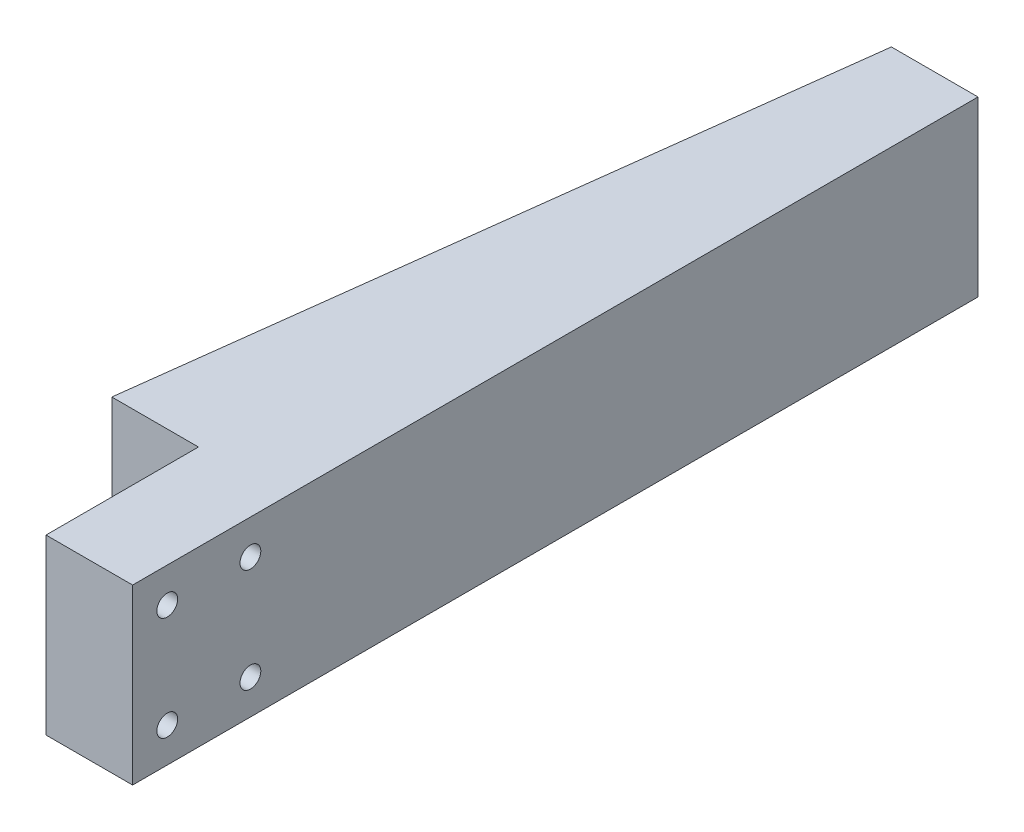
ISO-10303-21;
HEADER;
FILE_DESCRIPTION(('STEP AP214'),'2;1');
FILE_NAME('part.step','',(''),(''),'','','');
FILE_SCHEMA(('AUTOMOTIVE_DESIGN { 1 0 10303 214 1 1 1 1 }'));
ENDSEC;
DATA;
#1=APPLICATION_CONTEXT('core data for automotive mechanical design processes');
#2=APPLICATION_PROTOCOL_DEFINITION('international standard','automotive_design',2000,#1);
#3=PRODUCT_CONTEXT('',#1,'mechanical');
#4=PRODUCT('Part','Part','',(#3));
#5=PRODUCT_RELATED_PRODUCT_CATEGORY('part','',(#4));
#6=PRODUCT_DEFINITION_FORMATION('','',#4);
#7=PRODUCT_DEFINITION_CONTEXT('part definition',#1,'design');
#8=PRODUCT_DEFINITION('design','',#6,#7);
#9=PRODUCT_DEFINITION_SHAPE('','',#8);
#10=(LENGTH_UNIT() NAMED_UNIT(*) SI_UNIT(.MILLI.,.METRE.));
#11=(NAMED_UNIT(*) PLANE_ANGLE_UNIT() SI_UNIT($,.RADIAN.));
#12=(NAMED_UNIT(*) SI_UNIT($,.STERADIAN.) SOLID_ANGLE_UNIT());
#13=UNCERTAINTY_MEASURE_WITH_UNIT(LENGTH_MEASURE(1.E-05),#10,'distance_accuracy_value','');
#14=(GEOMETRIC_REPRESENTATION_CONTEXT(3) GLOBAL_UNCERTAINTY_ASSIGNED_CONTEXT((#13)) GLOBAL_UNIT_ASSIGNED_CONTEXT((#10,
#11,#12)) REPRESENTATION_CONTEXT('',''));
#15=CARTESIAN_POINT('',(0.,0.,0.));
#16=DIRECTION('',(0.,0.,1.));
#17=DIRECTION('',(1.,0.,0.));
#18=AXIS2_PLACEMENT_3D('',#15,#16,#17);
#19=CARTESIAN_POINT('',(-12.5,0.,0.));
#20=DIRECTION('',(0.,0.,1.));
#21=DIRECTION('',(1.,0.,0.));
#22=AXIS2_PLACEMENT_3D('',#19,#20,#21);
#23=PLANE('',#22);
#24=DIRECTION('',(0.,-1.,0.));
#25=VECTOR('',#24,1.);
#26=CARTESIAN_POINT('',(0.,0.,0.));
#27=LINE('',#26,#25);
#28=CARTESIAN_POINT('',(0.,25.,0.));
#29=VERTEX_POINT('',#28);
#30=CARTESIAN_POINT('',(0.,0.,0.));
#31=VERTEX_POINT('',#30);
#32=EDGE_CURVE('E164',#29,#31,#27,.T.);
#33=ORIENTED_EDGE('',*,*,#32,.F.);
#34=DIRECTION('',(1.,0.,0.));
#35=VECTOR('',#34,1.);
#36=CARTESIAN_POINT('',(-12.5,25.,0.));
#37=LINE('',#36,#35);
#38=CARTESIAN_POINT('',(-12.5,25.,0.));
#39=VERTEX_POINT('',#38);
#40=EDGE_CURVE('E11',#39,#29,#37,.T.);
#41=ORIENTED_EDGE('',*,*,#40,.F.);
#42=DIRECTION('',(0.,-1.,0.));
#43=VECTOR('',#42,1.);
#44=CARTESIAN_POINT('',(-12.5,0.,0.));
#45=LINE('',#44,#43);
#46=CARTESIAN_POINT('',(-12.5,0.,0.));
#47=VERTEX_POINT('',#46);
#48=EDGE_CURVE('E168',#39,#47,#45,.T.);
#49=ORIENTED_EDGE('',*,*,#48,.T.);
#50=DIRECTION('',(1.,0.,0.));
#51=VECTOR('',#50,1.);
#52=CARTESIAN_POINT('',(-12.5,0.,0.));
#53=LINE('',#52,#51);
#54=EDGE_CURVE('E48',#47,#31,#53,.T.);
#55=ORIENTED_EDGE('',*,*,#54,.T.);
#56=EDGE_LOOP('',(#33,#41,#49,#55));
#57=FACE_BOUND('',#56,.T.);
#58=ADVANCED_FACE('F45',(#57),#23,.T.);
#59=CARTESIAN_POINT('',(-12.5,25.,0.));
#60=DIRECTION('',(0.,1.,0.));
#61=DIRECTION('',(0.,0.,1.));
#62=AXIS2_PLACEMENT_3D('',#59,#60,#61);
#63=PLANE('',#62);
#64=DIRECTION('',(0.,0.,1.));
#65=VECTOR('',#64,1.);
#66=CARTESIAN_POINT('',(0.,25.,0.));
#67=LINE('',#66,#65);
#68=CARTESIAN_POINT('',(0.,25.,-122.));
#69=VERTEX_POINT('',#68);
#70=EDGE_CURVE('E172',#69,#29,#67,.T.);
#71=ORIENTED_EDGE('',*,*,#70,.F.);
#72=DIRECTION('',(1.,0.,0.));
#73=VECTOR('',#72,1.);
#74=CARTESIAN_POINT('',(-12.5,25.,-122.));
#75=LINE('',#74,#73);
#76=CARTESIAN_POINT('',(-12.5,25.,-122.));
#77=VERTEX_POINT('',#76);
#78=EDGE_CURVE('E54',#77,#69,#75,.T.);
#79=ORIENTED_EDGE('',*,*,#78,.F.);
#80=DIRECTION('',(-0.124034734589208,0.,0.992277876713668));
#81=VECTOR('',#80,1.);
#82=CARTESIAN_POINT('',(-12.5,25.,-122.));
#83=LINE('',#82,#81);
#84=CARTESIAN_POINT('',(-25.,25.,-22.));
#85=VERTEX_POINT('',#84);
#86=EDGE_CURVE('E128',#77,#85,#83,.T.);
#87=ORIENTED_EDGE('',*,*,#86,.T.);
#88=DIRECTION('',(1.,0.,0.));
#89=VECTOR('',#88,1.);
#90=CARTESIAN_POINT('',(-25.,25.,-22.));
#91=LINE('',#90,#89);
#92=CARTESIAN_POINT('',(-12.5,25.,-22.));
#93=VERTEX_POINT('',#92);
#94=EDGE_CURVE('E109',#85,#93,#91,.T.);
#95=ORIENTED_EDGE('',*,*,#94,.T.);
#96=DIRECTION('',(0.,0.,1.));
#97=VECTOR('',#96,1.);
#98=CARTESIAN_POINT('',(-12.5,25.,0.));
#99=LINE('',#98,#97);
#100=EDGE_CURVE('E69',#93,#39,#99,.T.);
#101=ORIENTED_EDGE('',*,*,#100,.T.);
#102=ORIENTED_EDGE('',*,*,#40,.T.);
#103=EDGE_LOOP('',(#71,#79,#87,#95,#101,#102));
#104=FACE_BOUND('',#103,.T.);
#105=ADVANCED_FACE('F202',(#104),#63,.T.);
#106=CARTESIAN_POINT('',(-12.5,0.,-122.));
#107=DIRECTION('',(0.,0.,-1.));
#108=DIRECTION('',(-1.,0.,0.));
#109=AXIS2_PLACEMENT_3D('',#106,#107,#108);
#110=PLANE('',#109);
#111=DIRECTION('',(0.,1.,0.));
#112=VECTOR('',#111,1.);
#113=CARTESIAN_POINT('',(0.,0.,-122.));
#114=LINE('',#113,#112);
#115=CARTESIAN_POINT('',(0.,0.,-122.));
#116=VERTEX_POINT('',#115);
#117=EDGE_CURVE('E186',#116,#69,#114,.T.);
#118=ORIENTED_EDGE('',*,*,#117,.F.);
#119=DIRECTION('',(1.,0.,0.));
#120=VECTOR('',#119,1.);
#121=CARTESIAN_POINT('',(-12.5,0.,-122.));
#122=LINE('',#121,#120);
#123=CARTESIAN_POINT('',(-12.5,0.,-122.));
#124=VERTEX_POINT('',#123);
#125=EDGE_CURVE('E194',#124,#116,#122,.T.);
#126=ORIENTED_EDGE('',*,*,#125,.F.);
#127=DIRECTION('',(0.,1.,0.));
#128=VECTOR('',#127,1.);
#129=CARTESIAN_POINT('',(-12.5,0.,-122.));
#130=LINE('',#129,#128);
#131=EDGE_CURVE('E120',#124,#77,#130,.T.);
#132=ORIENTED_EDGE('',*,*,#131,.T.);
#133=ORIENTED_EDGE('',*,*,#78,.T.);
#134=EDGE_LOOP('',(#118,#126,#132,#133));
#135=FACE_BOUND('',#134,.T.);
#136=ADVANCED_FACE('F204',(#135),#110,.T.);
#137=CARTESIAN_POINT('',(-12.5,0.,0.));
#138=DIRECTION('',(0.,-1.,0.));
#139=DIRECTION('',(0.,0.,-1.));
#140=AXIS2_PLACEMENT_3D('',#137,#138,#139);
#141=PLANE('',#140);
#142=DIRECTION('',(0.,0.,-1.));
#143=VECTOR('',#142,1.);
#144=CARTESIAN_POINT('',(0.,0.,0.));
#145=LINE('',#144,#143);
#146=EDGE_CURVE('E182',#31,#116,#145,.T.);
#147=ORIENTED_EDGE('',*,*,#146,.F.);
#148=ORIENTED_EDGE('',*,*,#54,.F.);
#149=DIRECTION('',(0.,0.,-1.));
#150=VECTOR('',#149,1.);
#151=CARTESIAN_POINT('',(-12.5,0.,0.));
#152=LINE('',#151,#150);
#153=CARTESIAN_POINT('',(-12.5,0.,-22.));
#154=VERTEX_POINT('',#153);
#155=EDGE_CURVE('E124',#47,#154,#152,.T.);
#156=ORIENTED_EDGE('',*,*,#155,.T.);
#157=DIRECTION('',(1.,0.,0.));
#158=VECTOR('',#157,1.);
#159=CARTESIAN_POINT('',(-25.,0.,-22.));
#160=LINE('',#159,#158);
#161=CARTESIAN_POINT('',(-25.,0.,-22.));
#162=VERTEX_POINT('',#161);
#163=EDGE_CURVE('E108',#162,#154,#160,.T.);
#164=ORIENTED_EDGE('',*,*,#163,.F.);
#165=DIRECTION('',(-0.124034734589208,0.,0.992277876713668));
#166=VECTOR('',#165,1.);
#167=CARTESIAN_POINT('',(-12.5,0.,-122.));
#168=LINE('',#167,#166);
#169=EDGE_CURVE('E117',#124,#162,#168,.T.);
#170=ORIENTED_EDGE('',*,*,#169,.F.);
#171=ORIENTED_EDGE('',*,*,#125,.T.);
#172=EDGE_LOOP('',(#147,#148,#156,#164,#170,#171));
#173=FACE_BOUND('',#172,.T.);
#174=ADVANCED_FACE('F123',(#173),#141,.T.);
#175=CARTESIAN_POINT('',(-12.5,0.,0.));
#176=DIRECTION('',(-1.,0.,0.));
#177=DIRECTION('',(0.,0.,1.));
#178=AXIS2_PLACEMENT_3D('',#175,#176,#177);
#179=PLANE('',#178);
#180=DIRECTION('',(0.,1.,0.));
#181=VECTOR('',#180,1.);
#182=CARTESIAN_POINT('',(-12.5,0.,-22.));
#183=LINE('',#182,#181);
#184=EDGE_CURVE('E62',#154,#93,#183,.T.);
#185=ORIENTED_EDGE('',*,*,#184,.F.);
#186=ORIENTED_EDGE('',*,*,#155,.F.);
#187=ORIENTED_EDGE('',*,*,#48,.F.);
#188=ORIENTED_EDGE('',*,*,#100,.F.);
#189=EDGE_LOOP('',(#185,#186,#187,#188));
#190=FACE_BOUND('',#189,.T.);
#191=CARTESIAN_POINT('',(-12.5,5.,-5.));
#192=DIRECTION('',(1.,0.,0.));
#193=DIRECTION('',(0.,0.,-1.));
#194=AXIS2_PLACEMENT_3D('',#191,#192,#193);
#195=CIRCLE('',#194,1.5);
#196=CARTESIAN_POINT('',(-12.5,5.,-6.5));
#197=VERTEX_POINT('',#196);
#198=EDGE_CURVE('E136',#197,#197,#195,.T.);
#199=ORIENTED_EDGE('',*,*,#198,.T.);
#200=EDGE_LOOP('',(#199));
#201=FACE_BOUND('',#200,.T.);
#202=CARTESIAN_POINT('',(-12.5,5.,-17.));
#203=DIRECTION('',(1.,0.,0.));
#204=DIRECTION('',(0.,0.,-1.));
#205=AXIS2_PLACEMENT_3D('',#202,#203,#204);
#206=CIRCLE('',#205,1.5);
#207=CARTESIAN_POINT('',(-12.5,5.,-18.5));
#208=VERTEX_POINT('',#207);
#209=EDGE_CURVE('E144',#208,#208,#206,.T.);
#210=ORIENTED_EDGE('',*,*,#209,.T.);
#211=EDGE_LOOP('',(#210));
#212=FACE_BOUND('',#211,.T.);
#213=CARTESIAN_POINT('',(-12.5,20.,-17.));
#214=DIRECTION('',(1.,0.,0.));
#215=DIRECTION('',(0.,0.,-1.));
#216=AXIS2_PLACEMENT_3D('',#213,#214,#215);
#217=CIRCLE('',#216,1.5);
#218=CARTESIAN_POINT('',(-12.5,20.,-18.5));
#219=VERTEX_POINT('',#218);
#220=EDGE_CURVE('E152',#219,#219,#217,.T.);
#221=ORIENTED_EDGE('',*,*,#220,.T.);
#222=EDGE_LOOP('',(#221));
#223=FACE_BOUND('',#222,.T.);
#224=CARTESIAN_POINT('',(-12.5,20.,-5.));
#225=DIRECTION('',(1.,0.,0.));
#226=DIRECTION('',(0.,0.,-1.));
#227=AXIS2_PLACEMENT_3D('',#224,#225,#226);
#228=CIRCLE('',#227,1.5);
#229=CARTESIAN_POINT('',(-12.5,20.,-6.5));
#230=VERTEX_POINT('',#229);
#231=EDGE_CURVE('E160',#230,#230,#228,.T.);
#232=ORIENTED_EDGE('',*,*,#231,.T.);
#233=EDGE_LOOP('',(#232));
#234=FACE_BOUND('',#233,.T.);
#235=ADVANCED_FACE('F211',(#190,#201,#212,#223,#234),#179,.T.);
#236=CARTESIAN_POINT('',(0.,0.,0.));
#237=DIRECTION('',(-1.,0.,0.));
#238=DIRECTION('',(0.,0.,1.));
#239=AXIS2_PLACEMENT_3D('',#236,#237,#238);
#240=PLANE('',#239);
#241=CARTESIAN_POINT('',(0.,5.,-5.));
#242=DIRECTION('',(1.,0.,0.));
#243=DIRECTION('',(0.,0.,-1.));
#244=AXIS2_PLACEMENT_3D('',#241,#242,#243);
#245=CIRCLE('',#244,1.5);
#246=CARTESIAN_POINT('',(0.,5.,-6.5));
#247=VERTEX_POINT('',#246);
#248=EDGE_CURVE('E134',#247,#247,#245,.T.);
#249=ORIENTED_EDGE('',*,*,#248,.F.);
#250=EDGE_LOOP('',(#249));
#251=FACE_BOUND('',#250,.T.);
#252=CARTESIAN_POINT('',(0.,5.,-17.));
#253=DIRECTION('',(1.,0.,0.));
#254=DIRECTION('',(0.,0.,-1.));
#255=AXIS2_PLACEMENT_3D('',#252,#253,#254);
#256=CIRCLE('',#255,1.5);
#257=CARTESIAN_POINT('',(0.,5.,-18.5));
#258=VERTEX_POINT('',#257);
#259=EDGE_CURVE('E140',#258,#258,#256,.T.);
#260=ORIENTED_EDGE('',*,*,#259,.F.);
#261=EDGE_LOOP('',(#260));
#262=FACE_BOUND('',#261,.T.);
#263=CARTESIAN_POINT('',(0.,20.,-17.));
#264=DIRECTION('',(1.,0.,0.));
#265=DIRECTION('',(0.,0.,-1.));
#266=AXIS2_PLACEMENT_3D('',#263,#264,#265);
#267=CIRCLE('',#266,1.5);
#268=CARTESIAN_POINT('',(0.,20.,-18.5));
#269=VERTEX_POINT('',#268);
#270=EDGE_CURVE('E148',#269,#269,#267,.T.);
#271=ORIENTED_EDGE('',*,*,#270,.F.);
#272=EDGE_LOOP('',(#271));
#273=FACE_BOUND('',#272,.T.);
#274=CARTESIAN_POINT('',(0.,20.,-5.));
#275=DIRECTION('',(1.,0.,0.));
#276=DIRECTION('',(0.,0.,-1.));
#277=AXIS2_PLACEMENT_3D('',#274,#275,#276);
#278=CIRCLE('',#277,1.5);
#279=CARTESIAN_POINT('',(0.,20.,-6.5));
#280=VERTEX_POINT('',#279);
#281=EDGE_CURVE('E156',#280,#280,#278,.T.);
#282=ORIENTED_EDGE('',*,*,#281,.F.);
#283=EDGE_LOOP('',(#282));
#284=FACE_BOUND('',#283,.T.);
#285=ORIENTED_EDGE('',*,*,#32,.T.);
#286=ORIENTED_EDGE('',*,*,#146,.T.);
#287=ORIENTED_EDGE('',*,*,#117,.T.);
#288=ORIENTED_EDGE('',*,*,#70,.T.);
#289=EDGE_LOOP('',(#285,#286,#287,#288));
#290=FACE_BOUND('',#289,.T.);
#291=ADVANCED_FACE('F201',(#251,#262,#273,#284,#290),#240,.F.);
#292=CARTESIAN_POINT('',(-12.5,20.,-5.));
#293=DIRECTION('',(1.,0.,0.));
#294=DIRECTION('',(0.,0.,-1.));
#295=AXIS2_PLACEMENT_3D('',#292,#293,#294);
#296=CYLINDRICAL_SURFACE('',#295,1.5);
#297=ORIENTED_EDGE('',*,*,#231,.F.);
#298=EDGE_LOOP('',(#297));
#299=FACE_BOUND('',#298,.T.);
#300=ORIENTED_EDGE('',*,*,#281,.T.);
#301=EDGE_LOOP('',(#300));
#302=FACE_BOUND('',#301,.T.);
#303=ADVANCED_FACE('F224',(#299,#302),#296,.F.);
#304=CARTESIAN_POINT('',(-12.5,20.,-17.));
#305=DIRECTION('',(1.,0.,0.));
#306=DIRECTION('',(0.,0.,-1.));
#307=AXIS2_PLACEMENT_3D('',#304,#305,#306);
#308=CYLINDRICAL_SURFACE('',#307,1.5);
#309=ORIENTED_EDGE('',*,*,#220,.F.);
#310=EDGE_LOOP('',(#309));
#311=FACE_BOUND('',#310,.T.);
#312=ORIENTED_EDGE('',*,*,#270,.T.);
#313=EDGE_LOOP('',(#312));
#314=FACE_BOUND('',#313,.T.);
#315=ADVANCED_FACE('F234',(#311,#314),#308,.F.);
#316=CARTESIAN_POINT('',(-12.5,5.,-17.));
#317=DIRECTION('',(1.,0.,0.));
#318=DIRECTION('',(0.,0.,-1.));
#319=AXIS2_PLACEMENT_3D('',#316,#317,#318);
#320=CYLINDRICAL_SURFACE('',#319,1.5);
#321=ORIENTED_EDGE('',*,*,#209,.F.);
#322=EDGE_LOOP('',(#321));
#323=FACE_BOUND('',#322,.T.);
#324=ORIENTED_EDGE('',*,*,#259,.T.);
#325=EDGE_LOOP('',(#324));
#326=FACE_BOUND('',#325,.T.);
#327=ADVANCED_FACE('F243',(#323,#326),#320,.F.);
#328=CARTESIAN_POINT('',(-12.5,5.,-5.));
#329=DIRECTION('',(1.,0.,0.));
#330=DIRECTION('',(0.,0.,-1.));
#331=AXIS2_PLACEMENT_3D('',#328,#329,#330);
#332=CYLINDRICAL_SURFACE('',#331,1.5);
#333=ORIENTED_EDGE('',*,*,#198,.F.);
#334=EDGE_LOOP('',(#333));
#335=FACE_BOUND('',#334,.T.);
#336=ORIENTED_EDGE('',*,*,#248,.T.);
#337=EDGE_LOOP('',(#336));
#338=FACE_BOUND('',#337,.T.);
#339=ADVANCED_FACE('F252',(#335,#338),#332,.F.);
#340=CARTESIAN_POINT('',(-25.,0.,-22.));
#341=DIRECTION('',(0.,0.,1.));
#342=DIRECTION('',(1.,0.,0.));
#343=AXIS2_PLACEMENT_3D('',#340,#341,#342);
#344=PLANE('',#343);
#345=ORIENTED_EDGE('',*,*,#94,.F.);
#346=DIRECTION('',(0.,1.,0.));
#347=VECTOR('',#346,1.);
#348=CARTESIAN_POINT('',(-25.,0.,-22.));
#349=LINE('',#348,#347);
#350=EDGE_CURVE('E104',#162,#85,#349,.T.);
#351=ORIENTED_EDGE('',*,*,#350,.F.);
#352=ORIENTED_EDGE('',*,*,#163,.T.);
#353=ORIENTED_EDGE('',*,*,#184,.T.);
#354=EDGE_LOOP('',(#345,#351,#352,#353));
#355=FACE_BOUND('',#354,.T.);
#356=ADVANCED_FACE('F106',(#355),#344,.T.);
#357=CARTESIAN_POINT('',(-12.5,0.,-122.));
#358=DIRECTION('',(-0.992277876713668,0.,-0.124034734589208));
#359=DIRECTION('',(-0.124034734589208,0.,0.992277876713668));
#360=AXIS2_PLACEMENT_3D('',#357,#358,#359);
#361=PLANE('',#360);
#362=ORIENTED_EDGE('',*,*,#86,.F.);
#363=ORIENTED_EDGE('',*,*,#131,.F.);
#364=ORIENTED_EDGE('',*,*,#169,.T.);
#365=ORIENTED_EDGE('',*,*,#350,.T.);
#366=EDGE_LOOP('',(#362,#363,#364,#365));
#367=FACE_BOUND('',#366,.T.);
#368=ADVANCED_FACE('F118',(#367),#361,.T.);
#369=CLOSED_SHELL('',(#58,#105,#136,#174,#235,#291,#303,#315,#327,#339,#356,#368));
#370=MANIFOLD_SOLID_BREP('B2',#369);
#371=ADVANCED_BREP_SHAPE_REPRESENTATION('',(#18,#370),#14);
#372=SHAPE_DEFINITION_REPRESENTATION(#9,#371);
ENDSEC;
END-ISO-10303-21;
